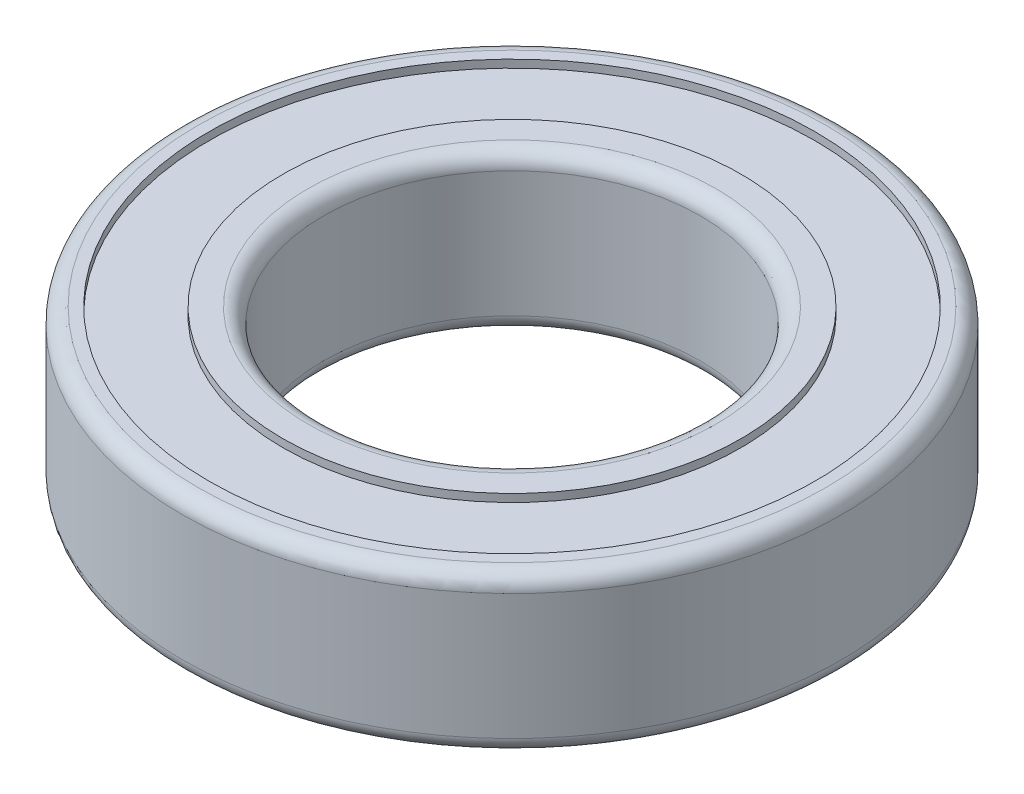
ISO-10303-21;
HEADER;
FILE_DESCRIPTION(('STEP AP214'),'2;1');
FILE_NAME('part.step','',(''),(''),'','','');
FILE_SCHEMA(('AUTOMOTIVE_DESIGN { 1 0 10303 214 1 1 1 1 }'));
ENDSEC;
DATA;
#1=APPLICATION_CONTEXT('core data for automotive mechanical design processes');
#2=APPLICATION_PROTOCOL_DEFINITION('international standard','automotive_design',2000,#1);
#3=PRODUCT_CONTEXT('',#1,'mechanical');
#4=PRODUCT('Part','Part','',(#3));
#5=PRODUCT_RELATED_PRODUCT_CATEGORY('part','',(#4));
#6=PRODUCT_DEFINITION_FORMATION('','',#4);
#7=PRODUCT_DEFINITION_CONTEXT('part definition',#1,'design');
#8=PRODUCT_DEFINITION('design','',#6,#7);
#9=PRODUCT_DEFINITION_SHAPE('','',#8);
#10=(LENGTH_UNIT() NAMED_UNIT(*) SI_UNIT(.MILLI.,.METRE.));
#11=(NAMED_UNIT(*) PLANE_ANGLE_UNIT() SI_UNIT($,.RADIAN.));
#12=(NAMED_UNIT(*) SI_UNIT($,.STERADIAN.) SOLID_ANGLE_UNIT());
#13=UNCERTAINTY_MEASURE_WITH_UNIT(LENGTH_MEASURE(1.E-05),#10,'distance_accuracy_value','');
#14=(GEOMETRIC_REPRESENTATION_CONTEXT(3) GLOBAL_UNCERTAINTY_ASSIGNED_CONTEXT((#13)) GLOBAL_UNIT_ASSIGNED_CONTEXT((#10,
#11,#12)) REPRESENTATION_CONTEXT('',''));
#15=CARTESIAN_POINT('',(0.,0.,0.));
#16=DIRECTION('',(0.,0.,1.));
#17=DIRECTION('',(1.,0.,0.));
#18=AXIS2_PLACEMENT_3D('',#15,#16,#17);
#19=CARTESIAN_POINT('',(0.,0.,0.));
#20=DIRECTION('',(0.,1.,0.));
#21=DIRECTION('',(0.,0.,1.));
#22=AXIS2_PLACEMENT_3D('',#19,#20,#21);
#23=CYLINDRICAL_SURFACE('',#22,6.);
#24=CARTESIAN_POINT('',(0.,0.5,0.));
#25=DIRECTION('',(0.,1.,0.));
#26=DIRECTION('',(0.,0.,1.));
#27=AXIS2_PLACEMENT_3D('',#24,#25,#26);
#28=CIRCLE('',#27,6.);
#29=CARTESIAN_POINT('',(0.,0.5,6.));
#30=VERTEX_POINT('',#29);
#31=EDGE_CURVE('E46',#30,#30,#28,.F.);
#32=ORIENTED_EDGE('',*,*,#31,.T.);
#33=EDGE_LOOP('',(#32));
#34=FACE_BOUND('',#33,.T.);
#35=CARTESIAN_POINT('',(0.,4.5,0.));
#36=DIRECTION('',(0.,-1.,0.));
#37=DIRECTION('',(0.,0.,-1.));
#38=AXIS2_PLACEMENT_3D('',#35,#36,#37);
#39=CIRCLE('',#38,6.);
#40=CARTESIAN_POINT('',(0.,4.5,-6.));
#41=VERTEX_POINT('',#40);
#42=EDGE_CURVE('E49',#41,#41,#39,.F.);
#43=ORIENTED_EDGE('',*,*,#42,.T.);
#44=EDGE_LOOP('',(#43));
#45=FACE_BOUND('',#44,.T.);
#46=ADVANCED_FACE('F39',(#34,#45),#23,.F.);
#47=CARTESIAN_POINT('',(6.,0.,0.));
#48=DIRECTION('',(0.,1.,0.));
#49=DIRECTION('',(0.,0.,1.));
#50=AXIS2_PLACEMENT_3D('',#47,#48,#49);
#51=PLANE('',#50);
#52=CARTESIAN_POINT('',(0.,0.,0.));
#53=DIRECTION('',(0.,1.,0.));
#54=DIRECTION('',(0.,0.,1.));
#55=AXIS2_PLACEMENT_3D('',#52,#53,#54);
#56=CIRCLE('',#55,6.5);
#57=CARTESIAN_POINT('',(0.,0.,6.5));
#58=VERTEX_POINT('',#57);
#59=EDGE_CURVE('E53',#58,#58,#56,.T.);
#60=ORIENTED_EDGE('',*,*,#59,.T.);
#61=EDGE_LOOP('',(#60));
#62=FACE_BOUND('',#61,.T.);
#63=CARTESIAN_POINT('',(0.,0.,0.));
#64=DIRECTION('',(0.,1.,0.));
#65=DIRECTION('',(0.,0.,1.));
#66=AXIS2_PLACEMENT_3D('',#63,#64,#65);
#67=CIRCLE('',#66,7.3);
#68=CARTESIAN_POINT('',(0.,0.,7.3));
#69=VERTEX_POINT('',#68);
#70=EDGE_CURVE('E72',#69,#69,#67,.T.);
#71=ORIENTED_EDGE('',*,*,#70,.F.);
#72=EDGE_LOOP('',(#71));
#73=FACE_BOUND('',#72,.T.);
#74=ADVANCED_FACE('F129',(#62,#73),#51,.F.);
#75=CARTESIAN_POINT('',(0.,0.,0.));
#76=DIRECTION('',(0.,1.,0.));
#77=DIRECTION('',(0.,0.,1.));
#78=AXIS2_PLACEMENT_3D('',#75,#76,#77);
#79=CYLINDRICAL_SURFACE('',#78,7.3);
#80=CARTESIAN_POINT('',(0.,0.250000000000001,0.));
#81=DIRECTION('',(0.,1.,0.));
#82=DIRECTION('',(0.,0.,1.));
#83=AXIS2_PLACEMENT_3D('',#80,#81,#82);
#84=CIRCLE('',#83,7.3);
#85=CARTESIAN_POINT('',(0.,0.250000000000001,7.3));
#86=VERTEX_POINT('',#85);
#87=EDGE_CURVE('E74',#86,#86,#84,.T.);
#88=ORIENTED_EDGE('',*,*,#87,.F.);
#89=EDGE_LOOP('',(#88));
#90=FACE_BOUND('',#89,.T.);
#91=ORIENTED_EDGE('',*,*,#70,.T.);
#92=EDGE_LOOP('',(#91));
#93=FACE_BOUND('',#92,.T.);
#94=ADVANCED_FACE('F134',(#90,#93),#79,.T.);
#95=CARTESIAN_POINT('',(7.3,0.250000000000001,0.));
#96=DIRECTION('',(0.,1.,0.));
#97=DIRECTION('',(0.,0.,1.));
#98=AXIS2_PLACEMENT_3D('',#95,#96,#97);
#99=PLANE('',#98);
#100=CARTESIAN_POINT('',(0.,0.250000000000001,0.));
#101=DIRECTION('',(0.,1.,0.));
#102=DIRECTION('',(0.,0.,1.));
#103=AXIS2_PLACEMENT_3D('',#100,#101,#102);
#104=CIRCLE('',#103,9.65);
#105=CARTESIAN_POINT('',(0.,0.250000000000001,9.65));
#106=VERTEX_POINT('',#105);
#107=EDGE_CURVE('E80',#106,#106,#104,.T.);
#108=ORIENTED_EDGE('',*,*,#107,.F.);
#109=EDGE_LOOP('',(#108));
#110=FACE_BOUND('',#109,.T.);
#111=ORIENTED_EDGE('',*,*,#87,.T.);
#112=EDGE_LOOP('',(#111));
#113=FACE_BOUND('',#112,.T.);
#114=ADVANCED_FACE('F159',(#110,#113),#99,.F.);
#115=CARTESIAN_POINT('',(0.,0.,0.));
#116=DIRECTION('',(0.,1.,0.));
#117=DIRECTION('',(0.,0.,1.));
#118=AXIS2_PLACEMENT_3D('',#115,#116,#117);
#119=CYLINDRICAL_SURFACE('',#118,9.65);
#120=CARTESIAN_POINT('',(0.,0.,0.));
#121=DIRECTION('',(0.,1.,0.));
#122=DIRECTION('',(0.,0.,1.));
#123=AXIS2_PLACEMENT_3D('',#120,#121,#122);
#124=CIRCLE('',#123,9.65);
#125=CARTESIAN_POINT('',(0.,0.,9.65));
#126=VERTEX_POINT('',#125);
#127=EDGE_CURVE('E77',#126,#126,#124,.T.);
#128=ORIENTED_EDGE('',*,*,#127,.F.);
#129=EDGE_LOOP('',(#128));
#130=FACE_BOUND('',#129,.T.);
#131=ORIENTED_EDGE('',*,*,#107,.T.);
#132=EDGE_LOOP('',(#131));
#133=FACE_BOUND('',#132,.T.);
#134=ADVANCED_FACE('F164',(#130,#133),#119,.F.);
#135=CARTESIAN_POINT('',(9.65,0.,0.));
#136=DIRECTION('',(0.,1.,0.));
#137=DIRECTION('',(0.,0.,1.));
#138=AXIS2_PLACEMENT_3D('',#135,#136,#137);
#139=PLANE('',#138);
#140=CARTESIAN_POINT('',(0.,0.,0.));
#141=DIRECTION('',(0.,1.,0.));
#142=DIRECTION('',(0.,0.,1.));
#143=AXIS2_PLACEMENT_3D('',#140,#141,#142);
#144=CIRCLE('',#143,10.);
#145=CARTESIAN_POINT('',(0.,0.,10.));
#146=VERTEX_POINT('',#145);
#147=EDGE_CURVE('E65',#146,#146,#144,.F.);
#148=ORIENTED_EDGE('',*,*,#147,.T.);
#149=EDGE_LOOP('',(#148));
#150=FACE_BOUND('',#149,.T.);
#151=ORIENTED_EDGE('',*,*,#127,.T.);
#152=EDGE_LOOP('',(#151));
#153=FACE_BOUND('',#152,.T.);
#154=ADVANCED_FACE('F121',(#150,#153),#139,.F.);
#155=CARTESIAN_POINT('',(0.,0.,0.));
#156=DIRECTION('',(0.,1.,0.));
#157=DIRECTION('',(0.,0.,1.));
#158=AXIS2_PLACEMENT_3D('',#155,#156,#157);
#159=CYLINDRICAL_SURFACE('',#158,10.5);
#160=CARTESIAN_POINT('',(0.,0.5,0.));
#161=DIRECTION('',(0.,1.,0.));
#162=DIRECTION('',(0.,0.,1.));
#163=AXIS2_PLACEMENT_3D('',#160,#161,#162);
#164=CIRCLE('',#163,10.5);
#165=CARTESIAN_POINT('',(0.,0.5,10.5));
#166=VERTEX_POINT('',#165);
#167=EDGE_CURVE('E62',#166,#166,#164,.T.);
#168=ORIENTED_EDGE('',*,*,#167,.T.);
#169=EDGE_LOOP('',(#168));
#170=FACE_BOUND('',#169,.T.);
#171=CARTESIAN_POINT('',(0.,4.5,0.));
#172=DIRECTION('',(0.,-1.,0.));
#173=DIRECTION('',(0.,0.,-1.));
#174=AXIS2_PLACEMENT_3D('',#171,#172,#173);
#175=CIRCLE('',#174,10.5);
#176=CARTESIAN_POINT('',(0.,4.5,-10.5));
#177=VERTEX_POINT('',#176);
#178=EDGE_CURVE('E68',#177,#177,#175,.T.);
#179=ORIENTED_EDGE('',*,*,#178,.T.);
#180=EDGE_LOOP('',(#179));
#181=FACE_BOUND('',#180,.T.);
#182=ADVANCED_FACE('F116',(#170,#181),#159,.T.);
#183=CARTESIAN_POINT('',(10.5,5.,0.));
#184=DIRECTION('',(0.,-1.,0.));
#185=DIRECTION('',(0.,0.,-1.));
#186=AXIS2_PLACEMENT_3D('',#183,#184,#185);
#187=PLANE('',#186);
#188=CARTESIAN_POINT('',(0.,5.,0.));
#189=DIRECTION('',(0.,-1.,0.));
#190=DIRECTION('',(0.,0.,-1.));
#191=AXIS2_PLACEMENT_3D('',#188,#189,#190);
#192=CIRCLE('',#191,10.);
#193=CARTESIAN_POINT('',(0.,5.,-10.));
#194=VERTEX_POINT('',#193);
#195=EDGE_CURVE('E56',#194,#194,#192,.F.);
#196=ORIENTED_EDGE('',*,*,#195,.T.);
#197=EDGE_LOOP('',(#196));
#198=FACE_BOUND('',#197,.T.);
#199=CARTESIAN_POINT('',(0.,5.,0.));
#200=DIRECTION('',(0.,1.,0.));
#201=DIRECTION('',(0.,0.,1.));
#202=AXIS2_PLACEMENT_3D('',#199,#200,#201);
#203=CIRCLE('',#202,9.65);
#204=CARTESIAN_POINT('',(0.,5.,9.65));
#205=VERTEX_POINT('',#204);
#206=EDGE_CURVE('E83',#205,#205,#203,.T.);
#207=ORIENTED_EDGE('',*,*,#206,.F.);
#208=EDGE_LOOP('',(#207));
#209=FACE_BOUND('',#208,.T.);
#210=ADVANCED_FACE('F114',(#198,#209),#187,.F.);
#211=CARTESIAN_POINT('',(0.,0.,0.));
#212=DIRECTION('',(0.,1.,0.));
#213=DIRECTION('',(0.,0.,1.));
#214=AXIS2_PLACEMENT_3D('',#211,#212,#213);
#215=CYLINDRICAL_SURFACE('',#214,9.65);
#216=CARTESIAN_POINT('',(0.,4.75,0.));
#217=DIRECTION('',(0.,1.,0.));
#218=DIRECTION('',(0.,0.,1.));
#219=AXIS2_PLACEMENT_3D('',#216,#217,#218);
#220=CIRCLE('',#219,9.65);
#221=CARTESIAN_POINT('',(0.,4.75,9.65));
#222=VERTEX_POINT('',#221);
#223=EDGE_CURVE('E88',#222,#222,#220,.T.);
#224=ORIENTED_EDGE('',*,*,#223,.F.);
#225=EDGE_LOOP('',(#224));
#226=FACE_BOUND('',#225,.T.);
#227=ORIENTED_EDGE('',*,*,#206,.T.);
#228=EDGE_LOOP('',(#227));
#229=FACE_BOUND('',#228,.T.);
#230=ADVANCED_FACE('F110',(#226,#229),#215,.F.);
#231=CARTESIAN_POINT('',(9.65,4.75,0.));
#232=DIRECTION('',(0.,-1.,0.));
#233=DIRECTION('',(0.,0.,-1.));
#234=AXIS2_PLACEMENT_3D('',#231,#232,#233);
#235=PLANE('',#234);
#236=CARTESIAN_POINT('',(0.,4.75,0.));
#237=DIRECTION('',(0.,1.,0.));
#238=DIRECTION('',(0.,0.,1.));
#239=AXIS2_PLACEMENT_3D('',#236,#237,#238);
#240=CIRCLE('',#239,7.3);
#241=CARTESIAN_POINT('',(0.,4.75,7.3));
#242=VERTEX_POINT('',#241);
#243=EDGE_CURVE('E90',#242,#242,#240,.T.);
#244=ORIENTED_EDGE('',*,*,#243,.F.);
#245=EDGE_LOOP('',(#244));
#246=FACE_BOUND('',#245,.T.);
#247=ORIENTED_EDGE('',*,*,#223,.T.);
#248=EDGE_LOOP('',(#247));
#249=FACE_BOUND('',#248,.T.);
#250=ADVANCED_FACE('F101',(#246,#249),#235,.F.);
#251=CARTESIAN_POINT('',(0.,0.,0.));
#252=DIRECTION('',(0.,1.,0.));
#253=DIRECTION('',(0.,0.,1.));
#254=AXIS2_PLACEMENT_3D('',#251,#252,#253);
#255=CYLINDRICAL_SURFACE('',#254,7.3);
#256=CARTESIAN_POINT('',(0.,5.,0.));
#257=DIRECTION('',(0.,1.,0.));
#258=DIRECTION('',(0.,0.,1.));
#259=AXIS2_PLACEMENT_3D('',#256,#257,#258);
#260=CIRCLE('',#259,7.3);
#261=CARTESIAN_POINT('',(0.,5.,7.3));
#262=VERTEX_POINT('',#261);
#263=EDGE_CURVE('E95',#262,#262,#260,.T.);
#264=ORIENTED_EDGE('',*,*,#263,.F.);
#265=EDGE_LOOP('',(#264));
#266=FACE_BOUND('',#265,.T.);
#267=ORIENTED_EDGE('',*,*,#243,.T.);
#268=EDGE_LOOP('',(#267));
#269=FACE_BOUND('',#268,.T.);
#270=ADVANCED_FACE('F98',(#266,#269),#255,.T.);
#271=CARTESIAN_POINT('',(7.3,5.,0.));
#272=DIRECTION('',(0.,-1.,0.));
#273=DIRECTION('',(0.,0.,-1.));
#274=AXIS2_PLACEMENT_3D('',#271,#272,#273);
#275=PLANE('',#274);
#276=CARTESIAN_POINT('',(0.,5.,0.));
#277=DIRECTION('',(0.,-1.,0.));
#278=DIRECTION('',(0.,0.,-1.));
#279=AXIS2_PLACEMENT_3D('',#276,#277,#278);
#280=CIRCLE('',#279,6.5);
#281=CARTESIAN_POINT('',(0.,5.,-6.5));
#282=VERTEX_POINT('',#281);
#283=EDGE_CURVE('E10',#282,#282,#280,.T.);
#284=ORIENTED_EDGE('',*,*,#283,.T.);
#285=EDGE_LOOP('',(#284));
#286=FACE_BOUND('',#285,.T.);
#287=ORIENTED_EDGE('',*,*,#263,.T.);
#288=EDGE_LOOP('',(#287));
#289=FACE_BOUND('',#288,.T.);
#290=ADVANCED_FACE('F96',(#286,#289),#275,.F.);
#291=CARTESIAN_POINT('',(0.,0.5,0.));
#292=DIRECTION('',(0.,1.,0.));
#293=DIRECTION('',(0.,0.,1.));
#294=AXIS2_PLACEMENT_3D('',#291,#292,#293);
#295=TOROIDAL_SURFACE('',#294,10.,0.5);
#296=ORIENTED_EDGE('',*,*,#147,.F.);
#297=EDGE_LOOP('',(#296));
#298=FACE_BOUND('',#297,.T.);
#299=ORIENTED_EDGE('',*,*,#167,.F.);
#300=EDGE_LOOP('',(#299));
#301=FACE_BOUND('',#300,.T.);
#302=ADVANCED_FACE('F136',(#298,#301),#295,.T.);
#303=CARTESIAN_POINT('',(0.,4.5,0.));
#304=DIRECTION('',(0.,-1.,0.));
#305=DIRECTION('',(0.,0.,-1.));
#306=AXIS2_PLACEMENT_3D('',#303,#304,#305);
#307=TOROIDAL_SURFACE('',#306,10.,0.5);
#308=ORIENTED_EDGE('',*,*,#178,.F.);
#309=EDGE_LOOP('',(#308));
#310=FACE_BOUND('',#309,.T.);
#311=ORIENTED_EDGE('',*,*,#195,.F.);
#312=EDGE_LOOP('',(#311));
#313=FACE_BOUND('',#312,.T.);
#314=ADVANCED_FACE('F141',(#310,#313),#307,.T.);
#315=CARTESIAN_POINT('',(0.,0.5,0.));
#316=DIRECTION('',(0.,1.,0.));
#317=DIRECTION('',(0.,0.,1.));
#318=AXIS2_PLACEMENT_3D('',#315,#316,#317);
#319=TOROIDAL_SURFACE('',#318,6.5,0.5);
#320=ORIENTED_EDGE('',*,*,#31,.F.);
#321=EDGE_LOOP('',(#320));
#322=FACE_BOUND('',#321,.T.);
#323=ORIENTED_EDGE('',*,*,#59,.F.);
#324=EDGE_LOOP('',(#323));
#325=FACE_BOUND('',#324,.T.);
#326=ADVANCED_FACE('F148',(#322,#325),#319,.T.);
#327=CARTESIAN_POINT('',(0.,4.5,0.));
#328=DIRECTION('',(0.,-1.,0.));
#329=DIRECTION('',(0.,0.,-1.));
#330=AXIS2_PLACEMENT_3D('',#327,#328,#329);
#331=TOROIDAL_SURFACE('',#330,6.5,0.5);
#332=ORIENTED_EDGE('',*,*,#283,.F.);
#333=EDGE_LOOP('',(#332));
#334=FACE_BOUND('',#333,.T.);
#335=ORIENTED_EDGE('',*,*,#42,.F.);
#336=EDGE_LOOP('',(#335));
#337=FACE_BOUND('',#336,.T.);
#338=ADVANCED_FACE('F41',(#334,#337),#331,.T.);
#339=CLOSED_SHELL('',(#46,#74,#94,#114,#134,#154,#182,#210,#230,#250,#270,#290,#302,#314,#326,#338));
#340=MANIFOLD_SOLID_BREP('B2',#339);
#341=ADVANCED_BREP_SHAPE_REPRESENTATION('',(#18,#340),#14);
#342=SHAPE_DEFINITION_REPRESENTATION(#9,#341);
ENDSEC;
END-ISO-10303-21;
